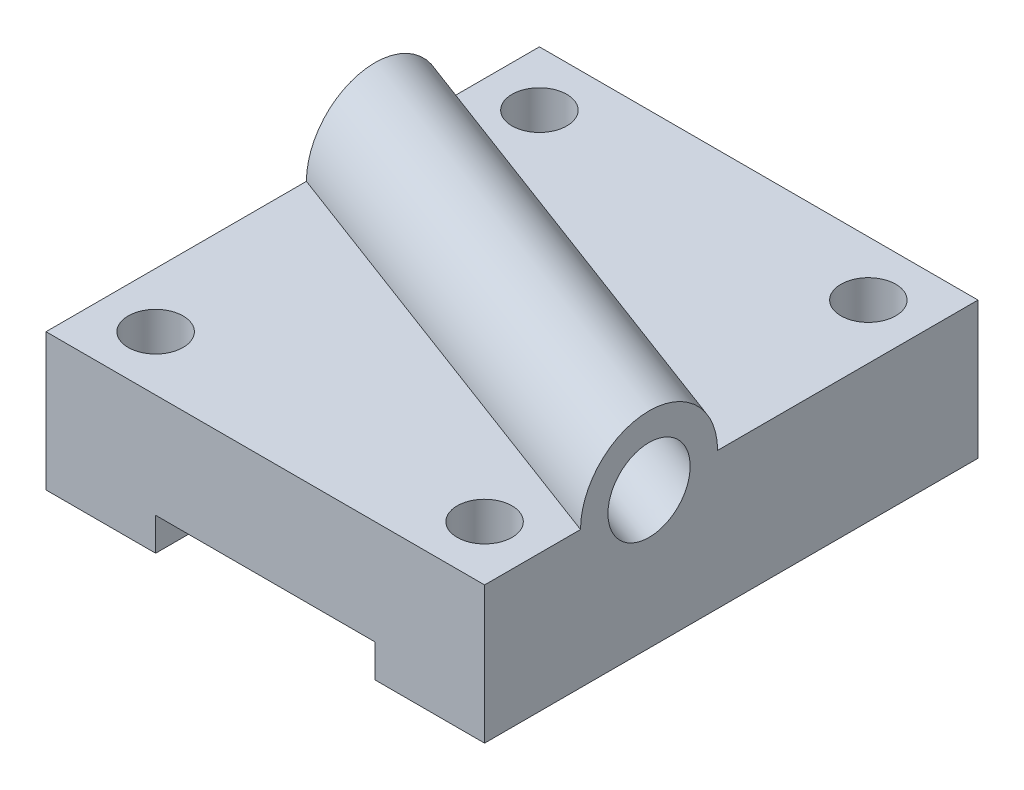
ISO-10303-21;
HEADER;
FILE_DESCRIPTION(('STEP AP214'),'2;1');
FILE_NAME('part.step','',(''),(''),'','','');
FILE_SCHEMA(('AUTOMOTIVE_DESIGN { 1 0 10303 214 1 1 1 1 }'));
ENDSEC;
DATA;
#1=APPLICATION_CONTEXT('core data for automotive mechanical design processes');
#2=APPLICATION_PROTOCOL_DEFINITION('international standard','automotive_design',2000,#1);
#3=PRODUCT_CONTEXT('',#1,'mechanical');
#4=PRODUCT('Part','Part','',(#3));
#5=PRODUCT_RELATED_PRODUCT_CATEGORY('part','',(#4));
#6=PRODUCT_DEFINITION_FORMATION('','',#4);
#7=PRODUCT_DEFINITION_CONTEXT('part definition',#1,'design');
#8=PRODUCT_DEFINITION('design','',#6,#7);
#9=PRODUCT_DEFINITION_SHAPE('','',#8);
#10=(LENGTH_UNIT() NAMED_UNIT(*) SI_UNIT(.MILLI.,.METRE.));
#11=(NAMED_UNIT(*) PLANE_ANGLE_UNIT() SI_UNIT($,.RADIAN.));
#12=(NAMED_UNIT(*) SI_UNIT($,.STERADIAN.) SOLID_ANGLE_UNIT());
#13=UNCERTAINTY_MEASURE_WITH_UNIT(LENGTH_MEASURE(1.E-05),#10,'distance_accuracy_value','');
#14=(GEOMETRIC_REPRESENTATION_CONTEXT(3) GLOBAL_UNCERTAINTY_ASSIGNED_CONTEXT((#13)) GLOBAL_UNIT_ASSIGNED_CONTEXT((#10,
#11,#12)) REPRESENTATION_CONTEXT('',''));
#15=CARTESIAN_POINT('',(0.,0.,0.));
#16=DIRECTION('',(0.,0.,1.));
#17=DIRECTION('',(1.,0.,0.));
#18=AXIS2_PLACEMENT_3D('',#15,#16,#17);
#19=CARTESIAN_POINT('',(40.,25.,-90.));
#20=DIRECTION('',(0.,1.,0.));
#21=DIRECTION('',(0.,0.,1.));
#22=AXIS2_PLACEMENT_3D('',#19,#20,#21);
#23=PLANE('',#22);
#24=CARTESIAN_POINT('',(30.,25.,-80.));
#25=DIRECTION('',(0.,1.,0.));
#26=DIRECTION('',(0.,0.,-1.));
#27=AXIS2_PLACEMENT_3D('',#24,#25,#26);
#28=CIRCLE('',#27,5.);
#29=CARTESIAN_POINT('',(30.,25.,-85.));
#30=VERTEX_POINT('',#29);
#31=EDGE_CURVE('E231',#30,#30,#28,.T.);
#32=ORIENTED_EDGE('',*,*,#31,.F.);
#33=EDGE_LOOP('',(#32));
#34=FACE_BOUND('',#33,.T.);
#35=CARTESIAN_POINT('',(-30.,25.,-80.));
#36=DIRECTION('',(0.,1.,0.));
#37=DIRECTION('',(0.,0.,1.));
#38=AXIS2_PLACEMENT_3D('',#35,#36,#37);
#39=CIRCLE('',#38,5.);
#40=CARTESIAN_POINT('',(-30.,25.,-75.));
#41=VERTEX_POINT('',#40);
#42=EDGE_CURVE('E234',#41,#41,#39,.T.);
#43=ORIENTED_EDGE('',*,*,#42,.F.);
#44=EDGE_LOOP('',(#43));
#45=FACE_BOUND('',#44,.T.);
#46=DIRECTION('',(-0.936329177569045,0.,-0.351123441588392));
#47=VECTOR('',#46,1.);
#48=CARTESIAN_POINT('',(0.,25.,-57.5));
#49=LINE('',#48,#47);
#50=CARTESIAN_POINT('',(40.,25.,-42.5));
#51=VERTEX_POINT('',#50);
#52=CARTESIAN_POINT('',(-40.,25.,-72.5));
#53=VERTEX_POINT('',#52);
#54=EDGE_CURVE('E168',#51,#53,#49,.T.);
#55=ORIENTED_EDGE('',*,*,#54,.F.);
#56=DIRECTION('',(0.,0.,1.));
#57=VECTOR('',#56,1.);
#58=CARTESIAN_POINT('',(40.,25.,-90.));
#59=LINE('',#58,#57);
#60=CARTESIAN_POINT('',(40.,25.,-90.));
#61=VERTEX_POINT('',#60);
#62=EDGE_CURVE('E155',#61,#51,#59,.T.);
#63=ORIENTED_EDGE('',*,*,#62,.F.);
#64=DIRECTION('',(-1.,0.,0.));
#65=VECTOR('',#64,1.);
#66=CARTESIAN_POINT('',(40.,25.,-90.));
#67=LINE('',#66,#65);
#68=CARTESIAN_POINT('',(-40.,25.,-90.));
#69=VERTEX_POINT('',#68);
#70=EDGE_CURVE('E368',#61,#69,#67,.T.);
#71=ORIENTED_EDGE('',*,*,#70,.T.);
#72=DIRECTION('',(0.,0.,1.));
#73=VECTOR('',#72,1.);
#74=CARTESIAN_POINT('',(-40.,25.,-90.));
#75=LINE('',#74,#73);
#76=EDGE_CURVE('E95',#69,#53,#75,.T.);
#77=ORIENTED_EDGE('',*,*,#76,.T.);
#78=EDGE_LOOP('',(#55,#63,#71,#77));
#79=FACE_BOUND('',#78,.T.);
#80=ADVANCED_FACE('F67',(#34,#45,#79),#23,.T.);
#81=CARTESIAN_POINT('',(40.,0.,-90.));
#82=DIRECTION('',(1.,0.,0.));
#83=DIRECTION('',(0.,0.,-1.));
#84=AXIS2_PLACEMENT_3D('',#81,#82,#83);
#85=PLANE('',#84);
#86=CARTESIAN_POINT('',(40.,25.,-30.));
#87=DIRECTION('',(1.,0.,0.));
#88=DIRECTION('',(0.,0.,-1.));
#89=AXIS2_PLACEMENT_3D('',#86,#87,#88);
#90=CIRCLE('',#89,7.5);
#91=CARTESIAN_POINT('',(40.,32.4991660657362,-30.1118405941961));
#92=VERTEX_POINT('',#91);
#93=EDGE_CURVE('E420',#92,#92,#90,.T.);
#94=ORIENTED_EDGE('',*,*,#93,.F.);
#95=EDGE_LOOP('',(#94));
#96=FACE_BOUND('',#95,.T.);
#97=DIRECTION('',(0.,1.,0.));
#98=VECTOR('',#97,1.);
#99=CARTESIAN_POINT('',(40.,0.,0.));
#100=LINE('',#99,#98);
#101=CARTESIAN_POINT('',(40.,0.,0.));
#102=VERTEX_POINT('',#101);
#103=CARTESIAN_POINT('',(40.,25.,0.));
#104=VERTEX_POINT('',#103);
#105=EDGE_CURVE('E174',#102,#104,#100,.T.);
#106=ORIENTED_EDGE('',*,*,#105,.F.);
#107=DIRECTION('',(0.,0.,1.));
#108=VECTOR('',#107,1.);
#109=CARTESIAN_POINT('',(40.,0.,-90.));
#110=LINE('',#109,#108);
#111=CARTESIAN_POINT('',(40.,0.,-90.));
#112=VERTEX_POINT('',#111);
#113=EDGE_CURVE('E12',#112,#102,#110,.T.);
#114=ORIENTED_EDGE('',*,*,#113,.F.);
#115=DIRECTION('',(0.,1.,0.));
#116=VECTOR('',#115,1.);
#117=CARTESIAN_POINT('',(40.,0.,-90.));
#118=LINE('',#117,#116);
#119=EDGE_CURVE('E323',#112,#61,#118,.T.);
#120=ORIENTED_EDGE('',*,*,#119,.T.);
#121=ORIENTED_EDGE('',*,*,#62,.T.);
#122=CARTESIAN_POINT('',(40.,25.,-30.));
#123=DIRECTION('',(1.,0.,0.));
#124=DIRECTION('',(0.,0.,-1.));
#125=AXIS2_PLACEMENT_3D('',#122,#123,#124);
#126=CIRCLE('',#125,12.5);
#127=CARTESIAN_POINT('',(40.,25.,-17.5));
#128=VERTEX_POINT('',#127);
#129=EDGE_CURVE('E162',#51,#128,#126,.T.);
#130=ORIENTED_EDGE('',*,*,#129,.T.);
#131=EDGE_CURVE('E146',#128,#104,#59,.T.);
#132=ORIENTED_EDGE('',*,*,#131,.T.);
#133=EDGE_LOOP('',(#106,#114,#120,#121,#130,#132));
#134=FACE_BOUND('',#133,.T.);
#135=ADVANCED_FACE('F69',(#96,#134),#85,.T.);
#136=CARTESIAN_POINT('',(20.,0.,-90.));
#137=DIRECTION('',(0.,-1.,0.));
#138=DIRECTION('',(1.,0.,0.));
#139=AXIS2_PLACEMENT_3D('',#136,#137,#138);
#140=PLANE('',#139);
#141=CARTESIAN_POINT('',(30.,0.,-10.));
#142=DIRECTION('',(0.,-1.,0.));
#143=DIRECTION('',(1.,0.,0.));
#144=AXIS2_PLACEMENT_3D('',#141,#142,#143);
#145=CIRCLE('',#144,5.);
#146=CARTESIAN_POINT('',(35.,0.,-10.));
#147=VERTEX_POINT('',#146);
#148=EDGE_CURVE('E486',#147,#147,#145,.F.);
#149=ORIENTED_EDGE('',*,*,#148,.T.);
#150=EDGE_LOOP('',(#149));
#151=FACE_BOUND('',#150,.T.);
#152=CARTESIAN_POINT('',(30.,0.,-80.));
#153=DIRECTION('',(0.,-1.,0.));
#154=DIRECTION('',(1.,0.,0.));
#155=AXIS2_PLACEMENT_3D('',#152,#153,#154);
#156=CIRCLE('',#155,5.);
#157=CARTESIAN_POINT('',(35.,0.,-80.));
#158=VERTEX_POINT('',#157);
#159=EDGE_CURVE('E422',#158,#158,#156,.F.);
#160=ORIENTED_EDGE('',*,*,#159,.T.);
#161=EDGE_LOOP('',(#160));
#162=FACE_BOUND('',#161,.T.);
#163=DIRECTION('',(1.,0.,0.));
#164=VECTOR('',#163,1.);
#165=CARTESIAN_POINT('',(20.,0.,0.));
#166=LINE('',#165,#164);
#167=CARTESIAN_POINT('',(20.,0.,0.));
#168=VERTEX_POINT('',#167);
#169=EDGE_CURVE('E319',#168,#102,#166,.T.);
#170=ORIENTED_EDGE('',*,*,#169,.F.);
#171=DIRECTION('',(0.,0.,1.));
#172=VECTOR('',#171,1.);
#173=CARTESIAN_POINT('',(20.,0.,-90.));
#174=LINE('',#173,#172);
#175=CARTESIAN_POINT('',(20.,0.,-90.));
#176=VERTEX_POINT('',#175);
#177=EDGE_CURVE('E79',#176,#168,#174,.T.);
#178=ORIENTED_EDGE('',*,*,#177,.F.);
#179=DIRECTION('',(1.,0.,0.));
#180=VECTOR('',#179,1.);
#181=CARTESIAN_POINT('',(20.,0.,-90.));
#182=LINE('',#181,#180);
#183=EDGE_CURVE('E156',#176,#112,#182,.T.);
#184=ORIENTED_EDGE('',*,*,#183,.T.);
#185=ORIENTED_EDGE('',*,*,#113,.T.);
#186=EDGE_LOOP('',(#170,#178,#184,#185));
#187=FACE_BOUND('',#186,.T.);
#188=ADVANCED_FACE('F226',(#151,#162,#187),#140,.T.);
#189=CARTESIAN_POINT('',(20.,6.00000000000001,-90.));
#190=DIRECTION('',(-1.,0.,0.));
#191=DIRECTION('',(0.,0.,1.));
#192=AXIS2_PLACEMENT_3D('',#189,#190,#191);
#193=PLANE('',#192);
#194=DIRECTION('',(0.,-1.,0.));
#195=VECTOR('',#194,1.);
#196=CARTESIAN_POINT('',(20.,6.00000000000001,0.));
#197=LINE('',#196,#195);
#198=CARTESIAN_POINT('',(20.,6.00000000000001,0.));
#199=VERTEX_POINT('',#198);
#200=EDGE_CURVE('E324',#199,#168,#197,.T.);
#201=ORIENTED_EDGE('',*,*,#200,.F.);
#202=DIRECTION('',(0.,0.,1.));
#203=VECTOR('',#202,1.);
#204=CARTESIAN_POINT('',(20.,6.00000000000001,-90.));
#205=LINE('',#204,#203);
#206=CARTESIAN_POINT('',(20.,6.00000000000001,-90.));
#207=VERTEX_POINT('',#206);
#208=EDGE_CURVE('E314',#207,#199,#205,.T.);
#209=ORIENTED_EDGE('',*,*,#208,.F.);
#210=DIRECTION('',(0.,-1.,0.));
#211=VECTOR('',#210,1.);
#212=CARTESIAN_POINT('',(20.,6.00000000000001,-90.));
#213=LINE('',#212,#211);
#214=EDGE_CURVE('E349',#207,#176,#213,.T.);
#215=ORIENTED_EDGE('',*,*,#214,.T.);
#216=ORIENTED_EDGE('',*,*,#177,.T.);
#217=EDGE_LOOP('',(#201,#209,#215,#216));
#218=FACE_BOUND('',#217,.T.);
#219=ADVANCED_FACE('F378',(#218),#193,.T.);
#220=CARTESIAN_POINT('',(-20.,6.,-90.));
#221=DIRECTION('',(0.,-1.,0.));
#222=DIRECTION('',(1.,0.,0.));
#223=AXIS2_PLACEMENT_3D('',#220,#221,#222);
#224=PLANE('',#223);
#225=DIRECTION('',(1.,0.,0.));
#226=VECTOR('',#225,1.);
#227=CARTESIAN_POINT('',(-20.,6.,0.));
#228=LINE('',#227,#226);
#229=CARTESIAN_POINT('',(-20.,6.,0.));
#230=VERTEX_POINT('',#229);
#231=EDGE_CURVE('E328',#230,#199,#228,.T.);
#232=ORIENTED_EDGE('',*,*,#231,.F.);
#233=DIRECTION('',(0.,0.,1.));
#234=VECTOR('',#233,1.);
#235=CARTESIAN_POINT('',(-20.,6.,-90.));
#236=LINE('',#235,#234);
#237=CARTESIAN_POINT('',(-20.,6.,-90.));
#238=VERTEX_POINT('',#237);
#239=EDGE_CURVE('E311',#238,#230,#236,.T.);
#240=ORIENTED_EDGE('',*,*,#239,.F.);
#241=DIRECTION('',(1.,0.,0.));
#242=VECTOR('',#241,1.);
#243=CARTESIAN_POINT('',(-20.,6.,-90.));
#244=LINE('',#243,#242);
#245=EDGE_CURVE('E353',#238,#207,#244,.T.);
#246=ORIENTED_EDGE('',*,*,#245,.T.);
#247=ORIENTED_EDGE('',*,*,#208,.T.);
#248=EDGE_LOOP('',(#232,#240,#246,#247));
#249=FACE_BOUND('',#248,.T.);
#250=ADVANCED_FACE('F383',(#249),#224,.T.);
#251=CARTESIAN_POINT('',(-20.,0.,-90.));
#252=DIRECTION('',(1.,0.,0.));
#253=DIRECTION('',(0.,0.,-1.));
#254=AXIS2_PLACEMENT_3D('',#251,#252,#253);
#255=PLANE('',#254);
#256=DIRECTION('',(0.,1.,0.));
#257=VECTOR('',#256,1.);
#258=CARTESIAN_POINT('',(-20.,0.,0.));
#259=LINE('',#258,#257);
#260=CARTESIAN_POINT('',(-20.,0.,0.));
#261=VERTEX_POINT('',#260);
#262=EDGE_CURVE('E332',#261,#230,#259,.T.);
#263=ORIENTED_EDGE('',*,*,#262,.F.);
#264=DIRECTION('',(0.,0.,1.));
#265=VECTOR('',#264,1.);
#266=CARTESIAN_POINT('',(-20.,0.,-90.));
#267=LINE('',#266,#265);
#268=CARTESIAN_POINT('',(-20.,0.,-90.));
#269=VERTEX_POINT('',#268);
#270=EDGE_CURVE('E308',#269,#261,#267,.T.);
#271=ORIENTED_EDGE('',*,*,#270,.F.);
#272=DIRECTION('',(0.,1.,0.));
#273=VECTOR('',#272,1.);
#274=CARTESIAN_POINT('',(-20.,0.,-90.));
#275=LINE('',#274,#273);
#276=EDGE_CURVE('E357',#269,#238,#275,.T.);
#277=ORIENTED_EDGE('',*,*,#276,.T.);
#278=ORIENTED_EDGE('',*,*,#239,.T.);
#279=EDGE_LOOP('',(#263,#271,#277,#278));
#280=FACE_BOUND('',#279,.T.);
#281=ADVANCED_FACE('F386',(#280),#255,.T.);
#282=CARTESIAN_POINT('',(-40.,0.,-90.));
#283=DIRECTION('',(0.,-1.,0.));
#284=DIRECTION('',(0.,0.,-1.));
#285=AXIS2_PLACEMENT_3D('',#282,#283,#284);
#286=PLANE('',#285);
#287=CARTESIAN_POINT('',(-30.,0.,-10.));
#288=DIRECTION('',(0.,-1.,0.));
#289=DIRECTION('',(0.,0.,-1.));
#290=AXIS2_PLACEMENT_3D('',#287,#288,#289);
#291=CIRCLE('',#290,5.);
#292=CARTESIAN_POINT('',(-30.,0.,-15.));
#293=VERTEX_POINT('',#292);
#294=EDGE_CURVE('E411',#293,#293,#291,.F.);
#295=ORIENTED_EDGE('',*,*,#294,.T.);
#296=EDGE_LOOP('',(#295));
#297=FACE_BOUND('',#296,.T.);
#298=CARTESIAN_POINT('',(-30.,0.,-80.));
#299=DIRECTION('',(0.,-1.,0.));
#300=DIRECTION('',(0.,0.,-1.));
#301=AXIS2_PLACEMENT_3D('',#298,#299,#300);
#302=CIRCLE('',#301,5.);
#303=CARTESIAN_POINT('',(-30.,0.,-85.));
#304=VERTEX_POINT('',#303);
#305=EDGE_CURVE('E414',#304,#304,#302,.F.);
#306=ORIENTED_EDGE('',*,*,#305,.T.);
#307=EDGE_LOOP('',(#306));
#308=FACE_BOUND('',#307,.T.);
#309=DIRECTION('',(1.,0.,0.));
#310=VECTOR('',#309,1.);
#311=CARTESIAN_POINT('',(-40.,0.,0.));
#312=LINE('',#311,#310);
#313=CARTESIAN_POINT('',(-40.,0.,0.));
#314=VERTEX_POINT('',#313);
#315=EDGE_CURVE('E336',#314,#261,#312,.T.);
#316=ORIENTED_EDGE('',*,*,#315,.F.);
#317=DIRECTION('',(0.,0.,1.));
#318=VECTOR('',#317,1.);
#319=CARTESIAN_POINT('',(-40.,0.,-90.));
#320=LINE('',#319,#318);
#321=CARTESIAN_POINT('',(-40.,0.,-90.));
#322=VERTEX_POINT('',#321);
#323=EDGE_CURVE('E299',#322,#314,#320,.T.);
#324=ORIENTED_EDGE('',*,*,#323,.F.);
#325=DIRECTION('',(1.,0.,0.));
#326=VECTOR('',#325,1.);
#327=CARTESIAN_POINT('',(-40.,0.,-90.));
#328=LINE('',#327,#326);
#329=EDGE_CURVE('E361',#322,#269,#328,.T.);
#330=ORIENTED_EDGE('',*,*,#329,.T.);
#331=ORIENTED_EDGE('',*,*,#270,.T.);
#332=EDGE_LOOP('',(#316,#324,#330,#331));
#333=FACE_BOUND('',#332,.T.);
#334=ADVANCED_FACE('F207',(#297,#308,#333),#286,.T.);
#335=CARTESIAN_POINT('',(-40.,25.,-90.));
#336=DIRECTION('',(-1.,0.,0.));
#337=DIRECTION('',(0.,0.,1.));
#338=AXIS2_PLACEMENT_3D('',#335,#336,#337);
#339=PLANE('',#338);
#340=CARTESIAN_POINT('',(-40.,25.,-60.));
#341=DIRECTION('',(-1.,0.,0.));
#342=DIRECTION('',(0.,0.,1.));
#343=AXIS2_PLACEMENT_3D('',#340,#341,#342);
#344=CIRCLE('',#343,7.5);
#345=CARTESIAN_POINT('',(-40.,32.4077860337324,-58.8275213953171));
#346=VERTEX_POINT('',#345);
#347=EDGE_CURVE('E194',#346,#346,#344,.T.);
#348=ORIENTED_EDGE('',*,*,#347,.F.);
#349=EDGE_LOOP('',(#348));
#350=FACE_BOUND('',#349,.T.);
#351=DIRECTION('',(0.,-1.,0.));
#352=VECTOR('',#351,1.);
#353=CARTESIAN_POINT('',(-40.,25.,0.));
#354=LINE('',#353,#352);
#355=CARTESIAN_POINT('',(-40.,25.,0.));
#356=VERTEX_POINT('',#355);
#357=EDGE_CURVE('E295',#356,#314,#354,.T.);
#358=ORIENTED_EDGE('',*,*,#357,.F.);
#359=CARTESIAN_POINT('',(-40.,25.,-47.5));
#360=VERTEX_POINT('',#359);
#361=EDGE_CURVE('E287',#360,#356,#75,.T.);
#362=ORIENTED_EDGE('',*,*,#361,.F.);
#363=CARTESIAN_POINT('',(-40.,25.,-60.));
#364=DIRECTION('',(-1.,0.,0.));
#365=DIRECTION('',(0.,0.,1.));
#366=AXIS2_PLACEMENT_3D('',#363,#364,#365);
#367=CIRCLE('',#366,12.5);
#368=EDGE_CURVE('E165',#360,#53,#367,.T.);
#369=ORIENTED_EDGE('',*,*,#368,.T.);
#370=ORIENTED_EDGE('',*,*,#76,.F.);
#371=DIRECTION('',(0.,-1.,0.));
#372=VECTOR('',#371,1.);
#373=CARTESIAN_POINT('',(-40.,25.,-90.));
#374=LINE('',#373,#372);
#375=EDGE_CURVE('E365',#69,#322,#374,.T.);
#376=ORIENTED_EDGE('',*,*,#375,.T.);
#377=ORIENTED_EDGE('',*,*,#323,.T.);
#378=EDGE_LOOP('',(#358,#362,#369,#370,#376,#377));
#379=FACE_BOUND('',#378,.T.);
#380=ADVANCED_FACE('F198',(#350,#379),#339,.T.);
#381=CARTESIAN_POINT('',(-30.,25.,-10.));
#382=DIRECTION('',(0.,1.,0.));
#383=DIRECTION('',(0.,0.,-1.));
#384=AXIS2_PLACEMENT_3D('',#381,#382,#383);
#385=CIRCLE('',#384,5.);
#386=CARTESIAN_POINT('',(-30.,25.,-15.));
#387=VERTEX_POINT('',#386);
#388=EDGE_CURVE('E492',#387,#387,#385,.T.);
#389=ORIENTED_EDGE('',*,*,#388,.F.);
#390=EDGE_LOOP('',(#389));
#391=FACE_BOUND('',#390,.T.);
#392=CARTESIAN_POINT('',(30.,25.,-10.));
#393=DIRECTION('',(0.,1.,0.));
#394=DIRECTION('',(0.,0.,1.));
#395=AXIS2_PLACEMENT_3D('',#392,#393,#394);
#396=CIRCLE('',#395,5.);
#397=CARTESIAN_POINT('',(30.,25.,-5.00000000000001));
#398=VERTEX_POINT('',#397);
#399=EDGE_CURVE('E482',#398,#398,#396,.T.);
#400=ORIENTED_EDGE('',*,*,#399,.F.);
#401=EDGE_LOOP('',(#400));
#402=FACE_BOUND('',#401,.T.);
#403=DIRECTION('',(0.936329177569045,0.,0.351123441588392));
#404=VECTOR('',#403,1.);
#405=CARTESIAN_POINT('',(0.,25.,-32.5));
#406=LINE('',#405,#404);
#407=EDGE_CURVE('E87',#360,#128,#406,.T.);
#408=ORIENTED_EDGE('',*,*,#407,.F.);
#409=ORIENTED_EDGE('',*,*,#361,.T.);
#410=DIRECTION('',(-1.,0.,0.));
#411=VECTOR('',#410,1.);
#412=CARTESIAN_POINT('',(40.,25.,0.));
#413=LINE('',#412,#411);
#414=EDGE_CURVE('E149',#104,#356,#413,.T.);
#415=ORIENTED_EDGE('',*,*,#414,.F.);
#416=ORIENTED_EDGE('',*,*,#131,.F.);
#417=EDGE_LOOP('',(#408,#409,#415,#416));
#418=FACE_BOUND('',#417,.T.);
#419=ADVANCED_FACE('F147',(#391,#402,#418),#23,.T.);
#420=CARTESIAN_POINT('',(0.,0.,-90.));
#421=DIRECTION('',(0.,0.,1.));
#422=DIRECTION('',(1.,0.,0.));
#423=AXIS2_PLACEMENT_3D('',#420,#421,#422);
#424=PLANE('',#423);
#425=ORIENTED_EDGE('',*,*,#119,.F.);
#426=ORIENTED_EDGE('',*,*,#183,.F.);
#427=ORIENTED_EDGE('',*,*,#214,.F.);
#428=ORIENTED_EDGE('',*,*,#245,.F.);
#429=ORIENTED_EDGE('',*,*,#276,.F.);
#430=ORIENTED_EDGE('',*,*,#329,.F.);
#431=ORIENTED_EDGE('',*,*,#375,.F.);
#432=ORIENTED_EDGE('',*,*,#70,.F.);
#433=EDGE_LOOP('',(#425,#426,#427,#428,#429,#430,#431,#432));
#434=FACE_BOUND('',#433,.T.);
#435=ADVANCED_FACE('F211',(#434),#424,.F.);
#436=CARTESIAN_POINT('',(0.,0.,0.));
#437=DIRECTION('',(0.,0.,1.));
#438=DIRECTION('',(1.,0.,0.));
#439=AXIS2_PLACEMENT_3D('',#436,#437,#438);
#440=PLANE('',#439);
#441=ORIENTED_EDGE('',*,*,#105,.T.);
#442=ORIENTED_EDGE('',*,*,#414,.T.);
#443=ORIENTED_EDGE('',*,*,#357,.T.);
#444=ORIENTED_EDGE('',*,*,#315,.T.);
#445=ORIENTED_EDGE('',*,*,#262,.T.);
#446=ORIENTED_EDGE('',*,*,#231,.T.);
#447=ORIENTED_EDGE('',*,*,#200,.T.);
#448=ORIENTED_EDGE('',*,*,#169,.T.);
#449=EDGE_LOOP('',(#441,#442,#443,#444,#445,#446,#447,#448));
#450=FACE_BOUND('',#449,.T.);
#451=ADVANCED_FACE('F216',(#450),#440,.T.);
#452=CARTESIAN_POINT('',(-40.,25.,-72.5));
#453=CARTESIAN_POINT('',(40.,25.,-42.5));
#454=CARTESIAN_POINT('',(-40.,25.5208333333333,-72.5));
#455=CARTESIAN_POINT('',(40.,25.5208333333333,-42.5));
#456=CARTESIAN_POINT('',(-40.,26.0745425118125,-72.4676951993108));
#457=CARTESIAN_POINT('',(40.,26.0745425118125,-42.4676951993108));
#458=CARTESIAN_POINT('',(-40.,27.244041558984,-72.3110658626361));
#459=CARTESIAN_POINT('',(40.,27.244041558984,-42.3110658626361));
#460=CARTESIAN_POINT('',(-40.,27.86,-72.1866666666667));
#461=CARTESIAN_POINT('',(40.,27.86,-42.1866666666667));
#462=CARTESIAN_POINT('',(-40.,29.14,-71.8133333333334));
#463=CARTESIAN_POINT('',(40.,29.14,-41.8133333333333));
#464=CARTESIAN_POINT('',(-40.,29.8042124310903,-71.5641964398435));
#465=CARTESIAN_POINT('',(40.,29.8042124310903,-41.5641964398435));
#466=CARTESIAN_POINT('',(-40.,31.1508437486849,-70.9077136725161));
#467=CARTESIAN_POINT('',(40.,31.1508437486849,-40.9077136725161));
#468=CARTESIAN_POINT('',(-40.,31.8333333333333,-70.5));
#469=CARTESIAN_POINT('',(40.,31.8333333333333,-40.5));
#470=CARTESIAN_POINT('',(-40.,33.1666666666667,-69.5));
#471=CARTESIAN_POINT('',(40.,33.1666666666667,-39.5));
#472=CARTESIAN_POINT('',(-40.,33.8173203227622,-68.9072371301683));
#473=CARTESIAN_POINT('',(40.,33.8173203227622,-38.9072371301683));
#474=CARTESIAN_POINT('',(-40.,35.0182961155939,-67.5311190342153));
#475=CARTESIAN_POINT('',(40.,35.0182961155939,-37.5311190342153));
#476=CARTESIAN_POINT('',(-40.,35.5680507497117,-66.7474048442906));
#477=CARTESIAN_POINT('',(40.,35.5680507497117,-36.7474048442907));
#478=CARTESIAN_POINT('',(-40.,36.4907727797001,-65.0173010380623));
#479=CARTESIAN_POINT('',(40.,36.4907727797001,-35.0173010380623));
#480=CARTESIAN_POINT('',(-40.,36.8629191321499,-64.0710059171598));
#481=CARTESIAN_POINT('',(40.,36.8629191321499,-34.0710059171598));
#482=CARTESIAN_POINT('',(-40.,37.3678500986193,-62.0828402366864));
#483=CARTESIAN_POINT('',(40.,37.3678500986193,-32.0828402366864));
#484=CARTESIAN_POINT('',(-40.,37.5,-61.0416666666667));
#485=CARTESIAN_POINT('',(40.,37.5,-31.0416666666667));
#486=CARTESIAN_POINT('',(-40.,37.5,-58.9583333333333));
#487=CARTESIAN_POINT('',(40.,37.5,-28.9583333333333));
#488=CARTESIAN_POINT('',(-40.,37.3678500986193,-57.9171597633136));
#489=CARTESIAN_POINT('',(40.,37.3678500986193,-27.9171597633136));
#490=CARTESIAN_POINT('',(-40.,36.8629191321499,-55.9289940828402));
#491=CARTESIAN_POINT('',(40.,36.8629191321499,-25.9289940828402));
#492=CARTESIAN_POINT('',(-40.,36.4907727797001,-54.9826989619377));
#493=CARTESIAN_POINT('',(40.,36.4907727797001,-24.9826989619377));
#494=CARTESIAN_POINT('',(-40.,35.5680507497116,-53.2525951557093));
#495=CARTESIAN_POINT('',(40.,35.5680507497116,-23.2525951557094));
#496=CARTESIAN_POINT('',(-40.,35.0182961155939,-52.4688809657847));
#497=CARTESIAN_POINT('',(40.,35.0182961155939,-22.4688809657847));
#498=CARTESIAN_POINT('',(-40.,33.8173203227622,-51.0927628698317));
#499=CARTESIAN_POINT('',(40.,33.8173203227622,-21.0927628698317));
#500=CARTESIAN_POINT('',(-40.,33.1666666666667,-50.5));
#501=CARTESIAN_POINT('',(40.,33.1666666666667,-20.5));
#502=CARTESIAN_POINT('',(-40.,31.8333333333333,-49.5));
#503=CARTESIAN_POINT('',(40.,31.8333333333333,-19.5));
#504=CARTESIAN_POINT('',(-40.,31.1508437486849,-49.0922863274839));
#505=CARTESIAN_POINT('',(40.,31.1508437486849,-19.0922863274839));
#506=CARTESIAN_POINT('',(-40.,29.8042124310903,-48.4358035601565));
#507=CARTESIAN_POINT('',(40.,29.8042124310903,-18.4358035601566));
#508=CARTESIAN_POINT('',(-40.,29.14,-48.1866666666667));
#509=CARTESIAN_POINT('',(40.,29.14,-18.1866666666667));
#510=CARTESIAN_POINT('',(-40.,27.86,-47.8133333333333));
#511=CARTESIAN_POINT('',(40.,27.86,-17.8133333333333));
#512=CARTESIAN_POINT('',(-40.,27.244041558984,-47.6889341373639));
#513=CARTESIAN_POINT('',(40.,27.244041558984,-17.6889341373639));
#514=CARTESIAN_POINT('',(-40.,26.0745425118125,-47.5323048006892));
#515=CARTESIAN_POINT('',(40.,26.0745425118125,-17.5323048006892));
#516=CARTESIAN_POINT('',(-40.,25.5208333333333,-47.5));
#517=CARTESIAN_POINT('',(40.,25.5208333333333,-17.5));
#518=CARTESIAN_POINT('',(-40.,25.,-47.5));
#519=CARTESIAN_POINT('',(40.,25.,-17.5));
#520=B_SPLINE_SURFACE_WITH_KNOTS('',3,1,((#452,#453),(#454,#455),(#456,#457),(#458,#459),(#460,
#461),(#462,#463),(#464,#465),(#466,#467),(#468,#469),(#470,#471),(#472,#473),(#474,#475),(#476,
#477),(#478,#479),(#480,#481),(#482,#483),(#484,#485),(#486,#487),(#488,#489),(#490,#491),(#492,
#493),(#494,#495),(#496,#497),(#498,#499),(#500,#501),(#502,#503),(#504,#505),(#506,#507),(#508,
#509),(#510,#511),(#512,#513),(#514,#515),(#516,#517),(#518,#519)),.UNSPECIFIED.,.F.,.F.,.F.,(4,
2,2,2,2,2,2,2,2,2,2,2,2,2,2,2,4),(2,2),(0.,0.0624999999999998,0.125,0.187499999999999,
0.249999999999999,0.312499999999999,0.374999999999999,0.437499999999998,0.499999999999998,
0.562499999999999,0.624999999999999,0.687499999999999,0.749999999999999,0.812499999999999,0.875,
0.9375,1.),(0.,1.),.UNSPECIFIED.);
#521=ORIENTED_EDGE('',*,*,#368,.F.);
#522=ORIENTED_EDGE('',*,*,#407,.T.);
#523=ORIENTED_EDGE('',*,*,#129,.F.);
#524=ORIENTED_EDGE('',*,*,#54,.T.);
#525=EDGE_LOOP('',(#521,#522,#523,#524));
#526=FACE_BOUND('',#525,.T.);
#527=ADVANCED_FACE('F161',(#526),#520,.T.);
#528=CARTESIAN_POINT('',(40.,32.4991660657362,-30.1118405941961));
#529=CARTESIAN_POINT('',(-40.,32.4077860337324,-58.8275213953171));
#530=CARTESIAN_POINT('',(40.,32.4898460162199,-30.7367710996741));
#531=CARTESIAN_POINT('',(-40.,32.5054925841226,-59.4448368981281));
#532=CARTESIAN_POINT('',(40.,32.4033116267409,-31.4425591694497));
#533=CARTESIAN_POINT('',(-40.,32.5409526687823,-60.1550253114355));
#534=CARTESIAN_POINT('',(40.,32.0501702717274,-32.5894206185268));
#535=CARTESIAN_POINT('',(-40.,32.3891765681504,-61.3453882877065));
#536=CARTESIAN_POINT('',(40.,31.8947618836995,-32.9856746749643));
#537=CARTESIAN_POINT('',(-40.,32.3038343332972,-61.7623843875238));
#538=CARTESIAN_POINT('',(40.,31.4888673766431,-33.7876899115392));
#539=CARTESIAN_POINT('',(-40.,32.0410993359438,-62.6220058808117));
#540=CARTESIAN_POINT('',(40.,31.2381599703912,-34.1934902150605));
#541=CARTESIAN_POINT('',(-40.,31.8634952388952,-63.0647076705067));
#542=CARTESIAN_POINT('',(40.,30.6262970217514,-34.9844540145367));
#543=CARTESIAN_POINT('',(-40.,31.3959367406961,-63.9486698024795));
#544=CARTESIAN_POINT('',(40.,30.2648572865527,-35.3694992038775));
#545=CARTESIAN_POINT('',(-40.,31.1056820992862,-64.3898621903955));
#546=CARTESIAN_POINT('',(40.,29.4285328086405,-36.0776920875446));
#547=CARTESIAN_POINT('',(-40.,30.4028125000758,-65.2306654487964));
#548=CARTESIAN_POINT('',(40.,28.9534377891797,-36.4004961064227));
#549=CARTESIAN_POINT('',(-40.,29.9899315813372,-65.629973674434));
#550=CARTESIAN_POINT('',(40.,27.9072351064612,-36.9385880982376));
#551=CARTESIAN_POINT('',(-40.,29.0511822233808,-66.3390806395099));
#552=CARTESIAN_POINT('',(40.,27.3361914802189,-37.1533843453714));
#553=CARTESIAN_POINT('',(-40.,28.5252927718326,-66.6483839463224));
#554=CARTESIAN_POINT('',(40.,26.138906969548,-37.4385206284292));
#555=CARTESIAN_POINT('',(-40.,27.3944219553902,-67.1341041290688));
#556=CARTESIAN_POINT('',(40.,25.5130899112819,-37.5084861152526));
#557=CARTESIAN_POINT('',(-40.,26.7897941074939,-67.3100794833421));
#558=CARTESIAN_POINT('',(40.,24.2632289003258,-37.4898460162199));
#559=CARTESIAN_POINT('',(-40.,25.5551631018719,-67.5054925841226));
#560=CARTESIAN_POINT('',(40.,23.6397765978186,-37.4012492540794));
#561=CARTESIAN_POINT('',(-40.,24.9257443848588,-67.5248378273869));
#562=CARTESIAN_POINT('',(40.,22.4515275718387,-37.0805357500512));
#563=CARTESIAN_POINT('',(-40.,23.7001502476121,-67.4120907203075));
#564=CARTESIAN_POINT('',(40.,21.8871433166661,-36.8488060295404));
#565=CARTESIAN_POINT('',(-40.,23.1044474142946,-67.2803091387709));
#566=CARTESIAN_POINT('',(40.,20.8574522787655,-36.2797547036919));
#567=CARTESIAN_POINT('',(-40.,21.9925985622212,-66.8957637251643));
#568=CARTESIAN_POINT('',(40.,20.3921948408953,-35.9429265151048));
#569=CARTESIAN_POINT('',(-40.,21.47658555607,-66.6434775987064));
#570=CARTESIAN_POINT('',(40.,19.5773612183889,-35.2101086929521));
#571=CARTESIAN_POINT('',(-40.,20.5484170093657,-66.060829384309));
#572=CARTESIAN_POINT('',(40.,19.2275646018323,-34.8144563113586));
#573=CARTESIAN_POINT('',(-40.,20.1361019694229,-65.7308372815975));
#574=CARTESIAN_POINT('',(40.,18.6395609799543,-34.0055980168111));
#575=CARTESIAN_POINT('',(-40.,19.4184147022248,-65.034471726374));
#576=CARTESIAN_POINT('',(40.,18.4010663802112,-33.5925018829863));
#577=CARTESIAN_POINT('',(-40.,19.1127778954291,-64.6682556259368));
#578=CARTESIAN_POINT('',(40.,18.0192691606304,-32.778739218767));
#579=CARTESIAN_POINT('',(-40.,18.5974194727516,-63.9317880524945));
#580=CARTESIAN_POINT('',(40.,17.8757465186771,-32.3780269834169));
#581=CARTESIAN_POINT('',(-40.,18.3874732595916,-63.5615291810378));
#582=CARTESIAN_POINT('',(40.,17.5569625942007,-31.2211446170998));
#583=CARTESIAN_POINT('',(-40.,17.8755117316011,-62.4762202877463));
#584=CARTESIAN_POINT('',(40.,17.4915138847474,-30.5130899112819));
#585=CARTESIAN_POINT('',(-40.,17.6899205166578,-61.7897941074939));
#586=CARTESIAN_POINT('',(40.,17.5101539837801,-29.2632289003258));
#587=CARTESIAN_POINT('',(-40.,17.4945074158774,-60.5551631018719));
#588=CARTESIAN_POINT('',(40.,17.5966883732591,-28.5574408305503));
#589=CARTESIAN_POINT('',(-40.,17.4590473312177,-59.8449746885646));
#590=CARTESIAN_POINT('',(40.,17.9498297282726,-27.4105793814732));
#591=CARTESIAN_POINT('',(-40.,17.6108234318496,-58.6546117122935));
#592=CARTESIAN_POINT('',(40.,18.1052381163005,-27.0143253250357));
#593=CARTESIAN_POINT('',(-40.,17.6961656667028,-58.2376156124762));
#594=CARTESIAN_POINT('',(40.,18.5111326233568,-26.2123100884608));
#595=CARTESIAN_POINT('',(-40.,17.9589006640562,-57.3779941191883));
#596=CARTESIAN_POINT('',(40.,18.7618400296088,-25.8065097849394));
#597=CARTESIAN_POINT('',(-40.,18.1365047611048,-56.9352923294933));
#598=CARTESIAN_POINT('',(40.,19.3737029782486,-25.0155459854633));
#599=CARTESIAN_POINT('',(-40.,18.6040632593039,-56.0513301975205));
#600=CARTESIAN_POINT('',(40.,19.7351427134473,-24.6305007961225));
#601=CARTESIAN_POINT('',(-40.,18.8943179007138,-55.6101378096045));
#602=CARTESIAN_POINT('',(40.,20.5714671913594,-23.9223079124554));
#603=CARTESIAN_POINT('',(-40.,19.5971874999242,-54.7693345512036));
#604=CARTESIAN_POINT('',(40.,21.0465622108203,-23.5995038935773));
#605=CARTESIAN_POINT('',(-40.,20.0100684186628,-54.370026325566));
#606=CARTESIAN_POINT('',(40.,22.0927648935388,-23.0614119017624));
#607=CARTESIAN_POINT('',(-40.,20.9488177766192,-53.6609193604901));
#608=CARTESIAN_POINT('',(40.,22.6638085197811,-22.8466156546286));
#609=CARTESIAN_POINT('',(-40.,21.4747072281674,-53.3516160536776));
#610=CARTESIAN_POINT('',(40.,23.861093030452,-22.5614793715708));
#611=CARTESIAN_POINT('',(-40.,22.6055780446098,-52.8658958709312));
#612=CARTESIAN_POINT('',(40.,24.4869100887181,-22.4915138847474));
#613=CARTESIAN_POINT('',(-40.,23.2102058925061,-52.6899205166578));
#614=CARTESIAN_POINT('',(40.,25.7367710996741,-22.5101539837801));
#615=CARTESIAN_POINT('',(-40.,24.4448368981281,-52.4945074158774));
#616=CARTESIAN_POINT('',(40.,26.3602234021814,-22.5987507459206));
#617=CARTESIAN_POINT('',(-40.,25.0742556151412,-52.4751621726131));
#618=CARTESIAN_POINT('',(40.,27.5484724281613,-22.9194642499488));
#619=CARTESIAN_POINT('',(-40.,26.2998497523879,-52.5879092796925));
#620=CARTESIAN_POINT('',(40.,28.1128566833339,-23.1511939704596));
#621=CARTESIAN_POINT('',(-40.,26.8955525857054,-52.7196908612291));
#622=CARTESIAN_POINT('',(40.,29.1425477212345,-23.7202452963081));
#623=CARTESIAN_POINT('',(-40.,28.0074014377788,-53.1042362748357));
#624=CARTESIAN_POINT('',(40.,29.6078051591047,-24.0570734848952));
#625=CARTESIAN_POINT('',(-40.,28.52341444393,-53.3565224012936));
#626=CARTESIAN_POINT('',(40.,30.4226387816111,-24.7898913070479));
#627=CARTESIAN_POINT('',(-40.,29.4515829906343,-53.939170615691));
#628=CARTESIAN_POINT('',(40.,30.7724353981677,-25.1855436886414));
#629=CARTESIAN_POINT('',(-40.,29.8638980305771,-54.2691627184025));
#630=CARTESIAN_POINT('',(40.,31.3604390200456,-25.9944019831889));
#631=CARTESIAN_POINT('',(-40.,30.5815852977752,-54.965528273626));
#632=CARTESIAN_POINT('',(40.,31.5989336197888,-26.4074981170137));
#633=CARTESIAN_POINT('',(-40.,30.8872221045709,-55.3317443740631));
#634=CARTESIAN_POINT('',(40.,31.9807308393695,-27.221260781233));
#635=CARTESIAN_POINT('',(-40.,31.4025805272484,-56.0682119475055));
#636=CARTESIAN_POINT('',(40.,32.1242534813229,-27.6219730165831));
#637=CARTESIAN_POINT('',(-40.,31.6125267404084,-56.4384708189622));
#638=CARTESIAN_POINT('',(40.,32.4430374057993,-28.7788553829002));
#639=CARTESIAN_POINT('',(-40.,32.1244882683989,-57.5237797122537));
#640=CARTESIAN_POINT('',(40.,32.5084861152526,-29.4869100887181));
#641=CARTESIAN_POINT('',(-40.,32.3100794833422,-58.210205892506));
#642=CARTESIAN_POINT('',(40.,32.4991660657362,-30.1118405941961));
#643=CARTESIAN_POINT('',(-40.,32.4077860337324,-58.8275213953171));
#644=B_SPLINE_SURFACE_WITH_KNOTS('',3,1,((#528,#529),(#530,#531),(#532,#533),(#534,#535),(#536,
#537),(#538,#539),(#540,#541),(#542,#543),(#544,#545),(#546,#547),(#548,#549),(#550,#551),(#552,
#553),(#554,#555),(#556,#557),(#558,#559),(#560,#561),(#562,#563),(#564,#565),(#566,#567),(#568,
#569),(#570,#571),(#572,#573),(#574,#575),(#576,#577),(#578,#579),(#580,#581),(#582,#583),(#584,
#585),(#586,#587),(#588,#589),(#590,#591),(#592,#593),(#594,#595),(#596,#597),(#598,#599),(#600,
#601),(#602,#603),(#604,#605),(#606,#607),(#608,#609),(#610,#611),(#612,#613),(#614,#615),(#616,
#617),(#618,#619),(#620,#621),(#622,#623),(#624,#625),(#626,#627),(#628,#629),(#630,#631),(#632,
#633),(#634,#635),(#636,#637),(#638,#639),(#640,#641),(#642,#643)),.UNSPECIFIED.,.T.,.F.,.F.,(4,
2,2,2,2,2,2,2,2,2,2,2,2,2,2,2,2,2,2,2,2,2,2,2,2,2,2,2,4),(2,2),(0.,0.0624999999999993,
0.0937499999999989,0.124999999999999,0.156249999999998,0.187500000000001,0.218750000000001,
0.250000000000001,0.281250000000001,0.312500000000001,0.343750000000001,0.375000000000001,
0.406250000000001,0.437500000000001,0.500000000000001,0.562500000000001,0.593750000000001,
0.625000000000001,0.656250000000001,0.6875,0.71875,0.75,0.78125,0.8125,0.84375,
0.874999999999999,0.906249999999999,0.9375,1.),(0.,1.),.UNSPECIFIED.);
#645=CARTESIAN_POINT('',(40.,32.4991660657362,-30.1118405941961));
#646=CARTESIAN_POINT('',(39.1666666666667,32.4982141904028,-30.4109622692078));
#647=CARTESIAN_POINT('',(38.3333333333333,32.4972623150695,-30.7100839442195));
#648=CARTESIAN_POINT('',(36.6666666666667,32.4953585644027,-31.3083272942428));
#649=CARTESIAN_POINT('',(35.8333333333333,32.4944066890693,-31.6074489692545));
#650=CARTESIAN_POINT('',(34.1666666666667,32.4925029384026,-32.2056923192779));
#651=CARTESIAN_POINT('',(33.3333333333333,32.4915510630692,-32.5048139942895));
#652=CARTESIAN_POINT('',(31.6666666666667,32.4896473124025,-33.1030573443129));
#653=CARTESIAN_POINT('',(30.8333333333333,32.4886954370691,-33.4021790193246));
#654=CARTESIAN_POINT('',(29.1666666666667,32.4867916864024,-34.0004223693479));
#655=CARTESIAN_POINT('',(28.3333333333333,32.485839811069,-34.2995440443596));
#656=CARTESIAN_POINT('',(26.6666666666667,32.4839360604022,-34.897787394383));
#657=CARTESIAN_POINT('',(25.8333333333333,32.4829841850689,-35.1969090693946));
#658=CARTESIAN_POINT('',(24.1666666666667,32.4810804344021,-35.795152419418));
#659=CARTESIAN_POINT('',(23.3333333333333,32.4801285590688,-36.0942740944297));
#660=CARTESIAN_POINT('',(21.6666666666667,32.478224808402,-36.692517444453));
#661=CARTESIAN_POINT('',(20.8333333333333,32.4772729330686,-36.9916391194647));
#662=CARTESIAN_POINT('',(19.1666666666667,32.4753691824019,-37.5898824694881));
#663=CARTESIAN_POINT('',(18.3333333333333,32.4744173070685,-37.8890041444997));
#664=CARTESIAN_POINT('',(16.6666666666667,32.4725135564018,-38.4872474945231));
#665=CARTESIAN_POINT('',(15.8333333333333,32.4715616810684,-38.7863691695348));
#666=CARTESIAN_POINT('',(14.1666666666667,32.4696579304017,-39.3846125195581));
#667=CARTESIAN_POINT('',(13.3333333333333,32.4687060550683,-39.6837341945698));
#668=CARTESIAN_POINT('',(11.6666666666667,32.4668023044015,-40.2819775445931));
#669=CARTESIAN_POINT('',(10.8333333333333,32.4658504290682,-40.5810992196048));
#670=CARTESIAN_POINT('',(9.16666666666666,32.4639466784014,-41.1793425696282));
#671=CARTESIAN_POINT('',(8.33333333333333,32.462994803068,-41.4784642446398));
#672=CARTESIAN_POINT('',(6.66666666666666,32.4610910524013,-42.0767075946632));
#673=CARTESIAN_POINT('',(5.83333333333333,32.4601391770679,-42.3758292696749));
#674=CARTESIAN_POINT('',(4.16666666666666,32.4582354264012,-42.9740726196982));
#675=CARTESIAN_POINT('',(3.33333333333333,32.4572835510678,-43.2731942947099));
#676=CARTESIAN_POINT('',(1.66666666666666,32.4553798004011,-43.8714376447333));
#677=CARTESIAN_POINT('',(0.833333333333328,32.4544279250677,-44.1705593197449));
#678=CARTESIAN_POINT('',(-0.833333333333339,32.4525241744009,-44.7688026697683));
#679=CARTESIAN_POINT('',(-1.66666666666667,32.4515722990676,-45.06792434478));
#680=CARTESIAN_POINT('',(-3.33333333333334,32.4496685484008,-45.6661676948033));
#681=CARTESIAN_POINT('',(-4.16666666666667,32.4487166730675,-45.965289369815));
#682=CARTESIAN_POINT('',(-5.83333333333334,32.4468129224007,-46.5635327198384));
#683=CARTESIAN_POINT('',(-6.66666666666667,32.4458610470673,-46.86265439485));
#684=CARTESIAN_POINT('',(-8.33333333333334,32.4439572964006,-47.4608977448734));
#685=CARTESIAN_POINT('',(-9.16666666666667,32.4430054210672,-47.7600194198851));
#686=CARTESIAN_POINT('',(-10.8333333333333,32.4411016704005,-48.3582627699084));
#687=CARTESIAN_POINT('',(-11.6666666666667,32.4401497950671,-48.6573844449201));
#688=CARTESIAN_POINT('',(-13.3333333333333,32.4382460444004,-49.2556277949435));
#689=CARTESIAN_POINT('',(-14.1666666666667,32.437294169067,-49.5547494699551));
#690=CARTESIAN_POINT('',(-15.8333333333333,32.4353904184002,-50.1529928199785));
#691=CARTESIAN_POINT('',(-16.6666666666667,32.4344385430669,-50.4521144949901));
#692=CARTESIAN_POINT('',(-18.3333333333333,32.4325347924001,-51.0503578450135));
#693=CARTESIAN_POINT('',(-19.1666666666667,32.4315829170667,-51.3494795200252));
#694=CARTESIAN_POINT('',(-20.8333333333333,32.4296791664,-51.9477228700485));
#695=CARTESIAN_POINT('',(-21.6666666666667,32.4287272910666,-52.2468445450602));
#696=CARTESIAN_POINT('',(-23.3333333333333,32.4268235403999,-52.8450878950836));
#697=CARTESIAN_POINT('',(-24.1666666666667,32.4258716650665,-53.1442095700952));
#698=CARTESIAN_POINT('',(-25.8333333333333,32.4239679143997,-53.7424529201186));
#699=CARTESIAN_POINT('',(-26.6666666666667,32.4230160390664,-54.0415745951303));
#700=CARTESIAN_POINT('',(-28.3333333333333,32.4211122883996,-54.6398179451536));
#701=CARTESIAN_POINT('',(-29.1666666666667,32.4201604130663,-54.9389396201653));
#702=CARTESIAN_POINT('',(-30.8333333333333,32.4182566623995,-55.5371829701887));
#703=CARTESIAN_POINT('',(-31.6666666666667,32.4173047870661,-55.8363046452003));
#704=CARTESIAN_POINT('',(-33.3333333333333,32.4154010363994,-56.4345479952237));
#705=CARTESIAN_POINT('',(-34.1666666666667,32.414449161066,-56.7336696702354));
#706=CARTESIAN_POINT('',(-35.8333333333333,32.4125454103993,-57.3319130202587));
#707=CARTESIAN_POINT('',(-36.6666666666667,32.4115935350659,-57.6310346952704));
#708=CARTESIAN_POINT('',(-38.3333333333333,32.4096897843992,-58.2292780452937));
#709=CARTESIAN_POINT('',(-39.1666666666667,32.4087379090658,-58.5283997203054));
#710=CARTESIAN_POINT('',(-40.,32.4077860337324,-58.8275213953171));
#711=B_SPLINE_CURVE_WITH_KNOTS('',3,(#645,#646,#647,#648,#649,#650,#651,#652,#653,#654,#655,
#656,#657,#658,#659,#660,#661,#662,#663,#664,#665,#666,#667,#668,#669,#670,#671,#672,#673,#674,
#675,#676,#677,#678,#679,#680,#681,#682,#683,#684,#685,#686,#687,#688,#689,#690,#691,#692,#693,
#694,#695,#696,#697,#698,#699,#700,#701,#702,#703,#704,#705,#706,#707,#708,#709,#710),
.UNSPECIFIED.,.F.,.F.,(4,2,2,2,2,2,2,2,2,2,2,2,2,2,2,2,2,2,2,2,2,2,2,2,2,2,2,2,2,2,2,2,4),(0.,
2.65617622584722,5.31235245169443,7.96852867754165,10.6247049033889,13.2808811292361,
15.9370573550833,18.5932335809305,21.2494098067777,23.905586032625,26.5617622584722,
29.2179384843194,31.8741147101666,34.5302909360138,37.1864671618611,39.8426433877083,
42.4988196135555,45.1549958394027,47.8111720652499,50.4673482910971,53.1235245169444,
55.7797007427916,58.4358769686388,61.092053194486,63.7482294203332,66.4044056461804,
69.0605818720277,71.7167580978749,74.3729343237221,77.0291105495693,79.6852867754165,
82.3414630012638,84.997639227111),.UNSPECIFIED.);
#712=EDGE_CURVE('BSEAM262',#92,#346,#711,.T.);
#713=ORIENTED_EDGE('',*,*,#93,.T.);
#714=ORIENTED_EDGE('',*,*,#347,.T.);
#715=ORIENTED_EDGE('',*,*,#712,.T.);
#716=ORIENTED_EDGE('',*,*,#712,.F.);
#717=EDGE_LOOP('',(#713,#715,#714,#716));
#718=FACE_BOUND('',#717,.T.);
#719=ADVANCED_FACE('F262',(#718),#644,.F.);
#720=CARTESIAN_POINT('',(30.,-0.001000000000001,-10.));
#721=DIRECTION('',(0.,1.,0.));
#722=DIRECTION('',(0.,0.,1.));
#723=AXIS2_PLACEMENT_3D('',#720,#721,#722);
#724=CYLINDRICAL_SURFACE('',#723,5.);
#725=ORIENTED_EDGE('',*,*,#148,.F.);
#726=EDGE_LOOP('',(#725));
#727=FACE_BOUND('',#726,.T.);
#728=ORIENTED_EDGE('',*,*,#399,.T.);
#729=EDGE_LOOP('',(#728));
#730=FACE_BOUND('',#729,.T.);
#731=ADVANCED_FACE('F452',(#727,#730),#724,.F.);
#732=CARTESIAN_POINT('',(-30.,-0.001000000000001,-10.));
#733=DIRECTION('',(0.,1.,0.));
#734=DIRECTION('',(0.,0.,1.));
#735=AXIS2_PLACEMENT_3D('',#732,#733,#734);
#736=CYLINDRICAL_SURFACE('',#735,5.);
#737=ORIENTED_EDGE('',*,*,#294,.F.);
#738=EDGE_LOOP('',(#737));
#739=FACE_BOUND('',#738,.T.);
#740=ORIENTED_EDGE('',*,*,#388,.T.);
#741=EDGE_LOOP('',(#740));
#742=FACE_BOUND('',#741,.T.);
#743=ADVANCED_FACE('F456',(#739,#742),#736,.F.);
#744=CARTESIAN_POINT('',(-30.,-0.001000000000001,-80.));
#745=DIRECTION('',(0.,1.,0.));
#746=DIRECTION('',(0.,0.,1.));
#747=AXIS2_PLACEMENT_3D('',#744,#745,#746);
#748=CYLINDRICAL_SURFACE('',#747,5.);
#749=ORIENTED_EDGE('',*,*,#305,.F.);
#750=EDGE_LOOP('',(#749));
#751=FACE_BOUND('',#750,.T.);
#752=ORIENTED_EDGE('',*,*,#42,.T.);
#753=EDGE_LOOP('',(#752));
#754=FACE_BOUND('',#753,.T.);
#755=ADVANCED_FACE('F462',(#751,#754),#748,.F.);
#756=CARTESIAN_POINT('',(30.,-0.001000000000001,-80.));
#757=DIRECTION('',(0.,1.,0.));
#758=DIRECTION('',(0.,0.,1.));
#759=AXIS2_PLACEMENT_3D('',#756,#757,#758);
#760=CYLINDRICAL_SURFACE('',#759,5.);
#761=ORIENTED_EDGE('',*,*,#159,.F.);
#762=EDGE_LOOP('',(#761));
#763=FACE_BOUND('',#762,.T.);
#764=ORIENTED_EDGE('',*,*,#31,.T.);
#765=EDGE_LOOP('',(#764));
#766=FACE_BOUND('',#765,.T.);
#767=ADVANCED_FACE('F468',(#763,#766),#760,.F.);
#768=CLOSED_SHELL('',(#80,#135,#188,#219,#250,#281,#334,#380,#419,#435,#451,#527,#719,#731,#743,
#755,#767));
#769=MANIFOLD_SOLID_BREP('B2',#768);
#770=ADVANCED_BREP_SHAPE_REPRESENTATION('',(#18,#769),#14);
#771=SHAPE_DEFINITION_REPRESENTATION(#9,#770);
ENDSEC;
END-ISO-10303-21;
